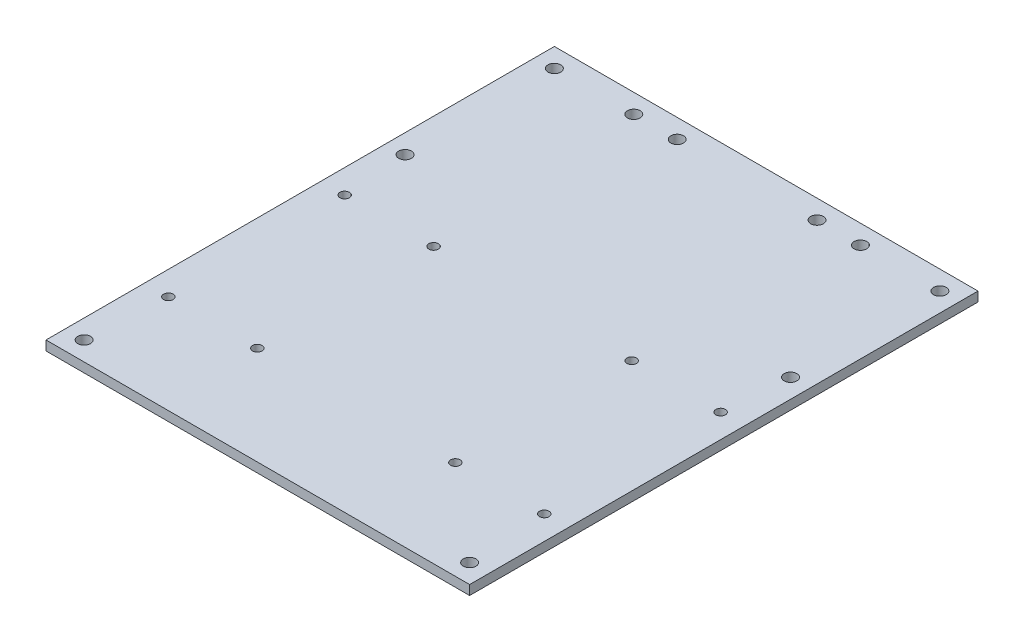
ISO-10303-21;
HEADER;
FILE_DESCRIPTION(('STEP AP214'),'2;1');
FILE_NAME('part.step','',(''),(''),'','','');
FILE_SCHEMA(('AUTOMOTIVE_DESIGN { 1 0 10303 214 1 1 1 1 }'));
ENDSEC;
DATA;
#1=APPLICATION_CONTEXT('core data for automotive mechanical design processes');
#2=APPLICATION_PROTOCOL_DEFINITION('international standard','automotive_design',2000,#1);
#3=PRODUCT_CONTEXT('',#1,'mechanical');
#4=PRODUCT('Part','Part','',(#3));
#5=PRODUCT_RELATED_PRODUCT_CATEGORY('part','',(#4));
#6=PRODUCT_DEFINITION_FORMATION('','',#4);
#7=PRODUCT_DEFINITION_CONTEXT('part definition',#1,'design');
#8=PRODUCT_DEFINITION('design','',#6,#7);
#9=PRODUCT_DEFINITION_SHAPE('','',#8);
#10=(LENGTH_UNIT() NAMED_UNIT(*) SI_UNIT(.MILLI.,.METRE.));
#11=(NAMED_UNIT(*) PLANE_ANGLE_UNIT() SI_UNIT($,.RADIAN.));
#12=(NAMED_UNIT(*) SI_UNIT($,.STERADIAN.) SOLID_ANGLE_UNIT());
#13=UNCERTAINTY_MEASURE_WITH_UNIT(LENGTH_MEASURE(1.E-05),#10,'distance_accuracy_value','');
#14=(GEOMETRIC_REPRESENTATION_CONTEXT(3) GLOBAL_UNCERTAINTY_ASSIGNED_CONTEXT((#13)) GLOBAL_UNIT_ASSIGNED_CONTEXT((#10,
#11,#12)) REPRESENTATION_CONTEXT('',''));
#15=CARTESIAN_POINT('',(0.,0.,0.));
#16=DIRECTION('',(0.,0.,1.));
#17=DIRECTION('',(1.,0.,0.));
#18=AXIS2_PLACEMENT_3D('',#15,#16,#17);
#19=CARTESIAN_POINT('',(66.665,3.,-80.));
#20=DIRECTION('',(-1.,0.,0.));
#21=DIRECTION('',(0.,0.,1.));
#22=AXIS2_PLACEMENT_3D('',#19,#20,#21);
#23=PLANE('',#22);
#24=DIRECTION('',(0.,0.,-1.));
#25=VECTOR('',#24,1.);
#26=CARTESIAN_POINT('',(66.665,0.,-80.));
#27=LINE('',#26,#25);
#28=CARTESIAN_POINT('',(66.665,0.,80.));
#29=VERTEX_POINT('',#28);
#30=CARTESIAN_POINT('',(66.665,0.,-80.));
#31=VERTEX_POINT('',#30);
#32=EDGE_CURVE('E108',#29,#31,#27,.T.);
#33=ORIENTED_EDGE('',*,*,#32,.T.);
#34=DIRECTION('',(0.,-1.,0.));
#35=VECTOR('',#34,1.);
#36=CARTESIAN_POINT('',(66.665,3.,-80.));
#37=LINE('',#36,#35);
#38=CARTESIAN_POINT('',(66.665,3.,-80.));
#39=VERTEX_POINT('',#38);
#40=EDGE_CURVE('E11',#39,#31,#37,.T.);
#41=ORIENTED_EDGE('',*,*,#40,.F.);
#42=DIRECTION('',(0.,0.,-1.));
#43=VECTOR('',#42,1.);
#44=CARTESIAN_POINT('',(66.665,3.,-80.));
#45=LINE('',#44,#43);
#46=CARTESIAN_POINT('',(66.665,3.,80.));
#47=VERTEX_POINT('',#46);
#48=EDGE_CURVE('E95',#47,#39,#45,.T.);
#49=ORIENTED_EDGE('',*,*,#48,.F.);
#50=DIRECTION('',(0.,-1.,0.));
#51=VECTOR('',#50,1.);
#52=CARTESIAN_POINT('',(66.665,3.,80.));
#53=LINE('',#52,#51);
#54=EDGE_CURVE('E104',#47,#29,#53,.T.);
#55=ORIENTED_EDGE('',*,*,#54,.T.);
#56=EDGE_LOOP('',(#33,#41,#49,#55));
#57=FACE_BOUND('',#56,.T.);
#58=ADVANCED_FACE('F42',(#57),#23,.F.);
#59=CARTESIAN_POINT('',(-66.665,3.,-80.));
#60=DIRECTION('',(0.,0.,1.));
#61=DIRECTION('',(1.,0.,0.));
#62=AXIS2_PLACEMENT_3D('',#59,#60,#61);
#63=PLANE('',#62);
#64=DIRECTION('',(-1.,0.,0.));
#65=VECTOR('',#64,1.);
#66=CARTESIAN_POINT('',(-66.665,0.,-80.));
#67=LINE('',#66,#65);
#68=CARTESIAN_POINT('',(-66.665,0.,-80.));
#69=VERTEX_POINT('',#68);
#70=EDGE_CURVE('E99',#31,#69,#67,.T.);
#71=ORIENTED_EDGE('',*,*,#70,.T.);
#72=DIRECTION('',(0.,-1.,0.));
#73=VECTOR('',#72,1.);
#74=CARTESIAN_POINT('',(-66.665,3.,-80.));
#75=LINE('',#74,#73);
#76=CARTESIAN_POINT('',(-66.665,3.,-80.));
#77=VERTEX_POINT('',#76);
#78=EDGE_CURVE('E51',#77,#69,#75,.T.);
#79=ORIENTED_EDGE('',*,*,#78,.F.);
#80=DIRECTION('',(-1.,0.,0.));
#81=VECTOR('',#80,1.);
#82=CARTESIAN_POINT('',(-66.665,3.,-80.));
#83=LINE('',#82,#81);
#84=EDGE_CURVE('E90',#39,#77,#83,.T.);
#85=ORIENTED_EDGE('',*,*,#84,.F.);
#86=ORIENTED_EDGE('',*,*,#40,.T.);
#87=EDGE_LOOP('',(#71,#79,#85,#86));
#88=FACE_BOUND('',#87,.T.);
#89=ADVANCED_FACE('F98',(#88),#63,.F.);
#90=CARTESIAN_POINT('',(-66.665,3.,-80.));
#91=DIRECTION('',(1.,0.,0.));
#92=DIRECTION('',(0.,0.,-1.));
#93=AXIS2_PLACEMENT_3D('',#90,#91,#92);
#94=PLANE('',#93);
#95=DIRECTION('',(0.,0.,1.));
#96=VECTOR('',#95,1.);
#97=CARTESIAN_POINT('',(-66.665,0.,-80.));
#98=LINE('',#97,#96);
#99=CARTESIAN_POINT('',(-66.665,0.,80.));
#100=VERTEX_POINT('',#99);
#101=EDGE_CURVE('E77',#69,#100,#98,.T.);
#102=ORIENTED_EDGE('',*,*,#101,.T.);
#103=DIRECTION('',(0.,-1.,0.));
#104=VECTOR('',#103,1.);
#105=CARTESIAN_POINT('',(-66.665,3.,80.));
#106=LINE('',#105,#104);
#107=CARTESIAN_POINT('',(-66.665,3.,80.));
#108=VERTEX_POINT('',#107);
#109=EDGE_CURVE('E100',#108,#100,#106,.T.);
#110=ORIENTED_EDGE('',*,*,#109,.F.);
#111=DIRECTION('',(0.,0.,1.));
#112=VECTOR('',#111,1.);
#113=CARTESIAN_POINT('',(-66.665,3.,-80.));
#114=LINE('',#113,#112);
#115=EDGE_CURVE('E93',#77,#108,#114,.T.);
#116=ORIENTED_EDGE('',*,*,#115,.F.);
#117=ORIENTED_EDGE('',*,*,#78,.T.);
#118=EDGE_LOOP('',(#102,#110,#116,#117));
#119=FACE_BOUND('',#118,.T.);
#120=ADVANCED_FACE('F102',(#119),#94,.F.);
#121=CARTESIAN_POINT('',(-66.665,3.,80.));
#122=DIRECTION('',(0.,0.,-1.));
#123=DIRECTION('',(-1.,0.,0.));
#124=AXIS2_PLACEMENT_3D('',#121,#122,#123);
#125=PLANE('',#124);
#126=DIRECTION('',(1.,0.,0.));
#127=VECTOR('',#126,1.);
#128=CARTESIAN_POINT('',(-66.665,0.,80.));
#129=LINE('',#128,#127);
#130=EDGE_CURVE('E83',#100,#29,#129,.T.);
#131=ORIENTED_EDGE('',*,*,#130,.T.);
#132=ORIENTED_EDGE('',*,*,#54,.F.);
#133=DIRECTION('',(1.,0.,0.));
#134=VECTOR('',#133,1.);
#135=CARTESIAN_POINT('',(-66.665,3.,80.));
#136=LINE('',#135,#134);
#137=EDGE_CURVE('E60',#108,#47,#136,.T.);
#138=ORIENTED_EDGE('',*,*,#137,.F.);
#139=ORIENTED_EDGE('',*,*,#109,.T.);
#140=EDGE_LOOP('',(#131,#132,#138,#139));
#141=FACE_BOUND('',#140,.T.);
#142=ADVANCED_FACE('F222',(#141),#125,.F.);
#143=CARTESIAN_POINT('',(0.,3.,0.));
#144=DIRECTION('',(0.,1.,0.));
#145=DIRECTION('',(0.,0.,1.));
#146=AXIS2_PLACEMENT_3D('',#143,#144,#145);
#147=PLANE('',#146);
#148=CARTESIAN_POINT('',(-22.,3.,-74.));
#149=DIRECTION('',(0.,1.,0.));
#150=DIRECTION('',(0.,0.,1.));
#151=AXIS2_PLACEMENT_3D('',#148,#149,#150);
#152=CIRCLE('',#151,2.00000000000001);
#153=CARTESIAN_POINT('',(-22.,3.,-72.));
#154=VERTEX_POINT('',#153);
#155=EDGE_CURVE('E505',#154,#154,#152,.T.);
#156=ORIENTED_EDGE('',*,*,#155,.F.);
#157=EDGE_LOOP('',(#156));
#158=FACE_BOUND('',#157,.T.);
#159=CARTESIAN_POINT('',(22.,3.,-74.));
#160=DIRECTION('',(0.,1.,0.));
#161=DIRECTION('',(0.,0.,-1.));
#162=AXIS2_PLACEMENT_3D('',#159,#160,#161);
#163=CIRCLE('',#162,2.00000000000001);
#164=CARTESIAN_POINT('',(22.,3.,-76.));
#165=VERTEX_POINT('',#164);
#166=EDGE_CURVE('E506',#165,#165,#163,.T.);
#167=ORIENTED_EDGE('',*,*,#166,.F.);
#168=EDGE_LOOP('',(#167));
#169=FACE_BOUND('',#168,.T.);
#170=CARTESIAN_POINT('',(-35.665,3.,-74.));
#171=DIRECTION('',(0.,1.,0.));
#172=DIRECTION('',(0.,0.,1.));
#173=AXIS2_PLACEMENT_3D('',#170,#171,#172);
#174=CIRCLE('',#173,2.);
#175=CARTESIAN_POINT('',(-35.665,3.,-72.));
#176=VERTEX_POINT('',#175);
#177=EDGE_CURVE('E118',#176,#176,#174,.T.);
#178=ORIENTED_EDGE('',*,*,#177,.F.);
#179=EDGE_LOOP('',(#178));
#180=FACE_BOUND('',#179,.T.);
#181=CARTESIAN_POINT('',(35.6650000000001,3.,-74.));
#182=DIRECTION('',(0.,1.,0.));
#183=DIRECTION('',(0.,0.,1.));
#184=AXIS2_PLACEMENT_3D('',#181,#182,#183);
#185=CIRCLE('',#184,2.);
#186=CARTESIAN_POINT('',(35.6650000000001,3.,-72.));
#187=VERTEX_POINT('',#186);
#188=EDGE_CURVE('E124',#187,#187,#185,.T.);
#189=ORIENTED_EDGE('',*,*,#188,.F.);
#190=EDGE_LOOP('',(#189));
#191=FACE_BOUND('',#190,.T.);
#192=CARTESIAN_POINT('',(59.165,3.,-6.50000000000002));
#193=DIRECTION('',(0.,1.,0.));
#194=DIRECTION('',(0.,0.,-1.));
#195=AXIS2_PLACEMENT_3D('',#192,#193,#194);
#196=CIRCLE('',#195,1.5);
#197=CARTESIAN_POINT('',(59.165,3.,-8.00000000000002));
#198=VERTEX_POINT('',#197);
#199=EDGE_CURVE('E160',#198,#198,#196,.T.);
#200=ORIENTED_EDGE('',*,*,#199,.F.);
#201=EDGE_LOOP('',(#200));
#202=FACE_BOUND('',#201,.T.);
#203=CARTESIAN_POINT('',(59.165,3.,49.));
#204=DIRECTION('',(0.,1.,0.));
#205=DIRECTION('',(0.,0.,-1.));
#206=AXIS2_PLACEMENT_3D('',#203,#204,#205);
#207=CIRCLE('',#206,1.5);
#208=CARTESIAN_POINT('',(59.165,3.,47.5));
#209=VERTEX_POINT('',#208);
#210=EDGE_CURVE('E154',#209,#209,#207,.T.);
#211=ORIENTED_EDGE('',*,*,#210,.F.);
#212=EDGE_LOOP('',(#211));
#213=FACE_BOUND('',#212,.T.);
#214=CARTESIAN_POINT('',(31.165,3.,49.));
#215=DIRECTION('',(0.,1.,0.));
#216=DIRECTION('',(0.,0.,-1.));
#217=AXIS2_PLACEMENT_3D('',#214,#215,#216);
#218=CIRCLE('',#217,1.5);
#219=CARTESIAN_POINT('',(31.165,3.,47.5));
#220=VERTEX_POINT('',#219);
#221=EDGE_CURVE('E148',#220,#220,#218,.T.);
#222=ORIENTED_EDGE('',*,*,#221,.F.);
#223=EDGE_LOOP('',(#222));
#224=FACE_BOUND('',#223,.T.);
#225=CARTESIAN_POINT('',(-31.165,3.,49.));
#226=DIRECTION('',(0.,1.,0.));
#227=DIRECTION('',(0.,0.,1.));
#228=AXIS2_PLACEMENT_3D('',#225,#226,#227);
#229=CIRCLE('',#228,1.5);
#230=CARTESIAN_POINT('',(-31.165,3.,50.5));
#231=VERTEX_POINT('',#230);
#232=EDGE_CURVE('E141',#231,#231,#229,.T.);
#233=ORIENTED_EDGE('',*,*,#232,.F.);
#234=EDGE_LOOP('',(#233));
#235=FACE_BOUND('',#234,.T.);
#236=CARTESIAN_POINT('',(60.665,3.,-27.));
#237=DIRECTION('',(0.,1.,0.));
#238=DIRECTION('',(0.,0.,-1.));
#239=AXIS2_PLACEMENT_3D('',#236,#237,#238);
#240=CIRCLE('',#239,2.);
#241=CARTESIAN_POINT('',(60.665,3.,-29.));
#242=VERTEX_POINT('',#241);
#243=EDGE_CURVE('E177',#242,#242,#240,.T.);
#244=ORIENTED_EDGE('',*,*,#243,.F.);
#245=EDGE_LOOP('',(#244));
#246=FACE_BOUND('',#245,.T.);
#247=CARTESIAN_POINT('',(-59.165,3.,-6.50000000000002));
#248=DIRECTION('',(0.,1.,0.));
#249=DIRECTION('',(0.,0.,1.));
#250=AXIS2_PLACEMENT_3D('',#247,#248,#249);
#251=CIRCLE('',#250,1.5);
#252=CARTESIAN_POINT('',(-59.165,3.,-5.00000000000002));
#253=VERTEX_POINT('',#252);
#254=EDGE_CURVE('E184',#253,#253,#251,.T.);
#255=ORIENTED_EDGE('',*,*,#254,.F.);
#256=EDGE_LOOP('',(#255));
#257=FACE_BOUND('',#256,.T.);
#258=CARTESIAN_POINT('',(-31.165,3.,-6.50000000000002));
#259=DIRECTION('',(0.,1.,0.));
#260=DIRECTION('',(0.,0.,1.));
#261=AXIS2_PLACEMENT_3D('',#258,#259,#260);
#262=CIRCLE('',#261,1.5);
#263=CARTESIAN_POINT('',(-31.165,3.,-5.00000000000002));
#264=VERTEX_POINT('',#263);
#265=EDGE_CURVE('E165',#264,#264,#262,.T.);
#266=ORIENTED_EDGE('',*,*,#265,.F.);
#267=EDGE_LOOP('',(#266));
#268=FACE_BOUND('',#267,.T.);
#269=CARTESIAN_POINT('',(-59.165,3.,49.));
#270=DIRECTION('',(0.,1.,0.));
#271=DIRECTION('',(0.,0.,1.));
#272=AXIS2_PLACEMENT_3D('',#269,#270,#271);
#273=CIRCLE('',#272,1.5);
#274=CARTESIAN_POINT('',(-59.165,3.,50.5));
#275=VERTEX_POINT('',#274);
#276=EDGE_CURVE('E172',#275,#275,#273,.T.);
#277=ORIENTED_EDGE('',*,*,#276,.F.);
#278=EDGE_LOOP('',(#277));
#279=FACE_BOUND('',#278,.T.);
#280=CARTESIAN_POINT('',(31.165,3.,-6.50000000000002));
#281=DIRECTION('',(0.,1.,0.));
#282=DIRECTION('',(0.,0.,-1.));
#283=AXIS2_PLACEMENT_3D('',#280,#281,#282);
#284=CIRCLE('',#283,1.5);
#285=CARTESIAN_POINT('',(31.165,3.,-8.00000000000002));
#286=VERTEX_POINT('',#285);
#287=EDGE_CURVE('E135',#286,#286,#284,.T.);
#288=ORIENTED_EDGE('',*,*,#287,.F.);
#289=EDGE_LOOP('',(#288));
#290=FACE_BOUND('',#289,.T.);
#291=CARTESIAN_POINT('',(-60.665,3.,-27.));
#292=DIRECTION('',(0.,1.,0.));
#293=DIRECTION('',(0.,0.,1.));
#294=AXIS2_PLACEMENT_3D('',#291,#292,#293);
#295=CIRCLE('',#294,2.);
#296=CARTESIAN_POINT('',(-60.665,3.,-25.));
#297=VERTEX_POINT('',#296);
#298=EDGE_CURVE('E180',#297,#297,#295,.T.);
#299=ORIENTED_EDGE('',*,*,#298,.F.);
#300=EDGE_LOOP('',(#299));
#301=FACE_BOUND('',#300,.T.);
#302=CARTESIAN_POINT('',(-60.665,3.,74.));
#303=DIRECTION('',(0.,1.,0.));
#304=DIRECTION('',(0.,0.,-1.));
#305=AXIS2_PLACEMENT_3D('',#302,#303,#304);
#306=CIRCLE('',#305,2.);
#307=CARTESIAN_POINT('',(-60.665,3.,72.));
#308=VERTEX_POINT('',#307);
#309=EDGE_CURVE('E208',#308,#308,#306,.T.);
#310=ORIENTED_EDGE('',*,*,#309,.F.);
#311=EDGE_LOOP('',(#310));
#312=FACE_BOUND('',#311,.T.);
#313=CARTESIAN_POINT('',(60.6650000000001,3.,73.9999999999999));
#314=DIRECTION('',(0.,1.,0.));
#315=DIRECTION('',(0.,0.,1.));
#316=AXIS2_PLACEMENT_3D('',#313,#314,#315);
#317=CIRCLE('',#316,2.);
#318=CARTESIAN_POINT('',(60.6650000000001,3.,75.9999999999999));
#319=VERTEX_POINT('',#318);
#320=EDGE_CURVE('E202',#319,#319,#317,.T.);
#321=ORIENTED_EDGE('',*,*,#320,.F.);
#322=EDGE_LOOP('',(#321));
#323=FACE_BOUND('',#322,.T.);
#324=CARTESIAN_POINT('',(60.6650000000001,3.,-73.9999999999999));
#325=DIRECTION('',(0.,1.,0.));
#326=DIRECTION('',(0.,0.,-1.));
#327=AXIS2_PLACEMENT_3D('',#324,#325,#326);
#328=CIRCLE('',#327,2.);
#329=CARTESIAN_POINT('',(60.6650000000001,3.,-75.9999999999999));
#330=VERTEX_POINT('',#329);
#331=EDGE_CURVE('E195',#330,#330,#328,.T.);
#332=ORIENTED_EDGE('',*,*,#331,.F.);
#333=EDGE_LOOP('',(#332));
#334=FACE_BOUND('',#333,.T.);
#335=CARTESIAN_POINT('',(-60.665,3.,-74.));
#336=DIRECTION('',(0.,1.,0.));
#337=DIRECTION('',(0.,0.,1.));
#338=AXIS2_PLACEMENT_3D('',#335,#336,#337);
#339=CIRCLE('',#338,2.);
#340=CARTESIAN_POINT('',(-60.665,3.,-72.));
#341=VERTEX_POINT('',#340);
#342=EDGE_CURVE('E198',#341,#341,#339,.T.);
#343=ORIENTED_EDGE('',*,*,#342,.F.);
#344=EDGE_LOOP('',(#343));
#345=FACE_BOUND('',#344,.T.);
#346=ORIENTED_EDGE('',*,*,#48,.T.);
#347=ORIENTED_EDGE('',*,*,#84,.T.);
#348=ORIENTED_EDGE('',*,*,#115,.T.);
#349=ORIENTED_EDGE('',*,*,#137,.T.);
#350=EDGE_LOOP('',(#346,#347,#348,#349));
#351=FACE_BOUND('',#350,.T.);
#352=ADVANCED_FACE('F91',(#158,#169,#180,#191,#202,#213,#224,#235,#246,#257,#268,#279,#290,#301,
#312,#323,#334,#345,#351),#147,.T.);
#353=CARTESIAN_POINT('',(0.,0.,0.));
#354=DIRECTION('',(0.,1.,0.));
#355=DIRECTION('',(0.,0.,1.));
#356=AXIS2_PLACEMENT_3D('',#353,#354,#355);
#357=PLANE('',#356);
#358=CARTESIAN_POINT('',(-22.,0.,-74.));
#359=DIRECTION('',(0.,1.,0.));
#360=DIRECTION('',(0.,0.,1.));
#361=AXIS2_PLACEMENT_3D('',#358,#359,#360);
#362=CIRCLE('',#361,2.00000000000001);
#363=CARTESIAN_POINT('',(-22.,0.,-72.));
#364=VERTEX_POINT('',#363);
#365=EDGE_CURVE('E129',#364,#364,#362,.T.);
#366=ORIENTED_EDGE('',*,*,#365,.T.);
#367=EDGE_LOOP('',(#366));
#368=FACE_BOUND('',#367,.T.);
#369=CARTESIAN_POINT('',(22.,0.,-74.));
#370=DIRECTION('',(0.,1.,0.));
#371=DIRECTION('',(0.,0.,-1.));
#372=AXIS2_PLACEMENT_3D('',#369,#370,#371);
#373=CIRCLE('',#372,2.00000000000001);
#374=CARTESIAN_POINT('',(22.,0.,-76.));
#375=VERTEX_POINT('',#374);
#376=EDGE_CURVE('E132',#375,#375,#373,.T.);
#377=ORIENTED_EDGE('',*,*,#376,.T.);
#378=EDGE_LOOP('',(#377));
#379=FACE_BOUND('',#378,.T.);
#380=CARTESIAN_POINT('',(-35.665,0.,-74.));
#381=DIRECTION('',(0.,1.,0.));
#382=DIRECTION('',(0.,0.,1.));
#383=AXIS2_PLACEMENT_3D('',#380,#381,#382);
#384=CIRCLE('',#383,2.);
#385=CARTESIAN_POINT('',(-35.665,0.,-72.));
#386=VERTEX_POINT('',#385);
#387=EDGE_CURVE('E45',#386,#386,#384,.T.);
#388=ORIENTED_EDGE('',*,*,#387,.T.);
#389=EDGE_LOOP('',(#388));
#390=FACE_BOUND('',#389,.T.);
#391=CARTESIAN_POINT('',(35.6650000000001,0.,-74.));
#392=DIRECTION('',(0.,1.,0.));
#393=DIRECTION('',(0.,0.,1.));
#394=AXIS2_PLACEMENT_3D('',#391,#392,#393);
#395=CIRCLE('',#394,2.);
#396=CARTESIAN_POINT('',(35.6650000000001,0.,-72.));
#397=VERTEX_POINT('',#396);
#398=EDGE_CURVE('E116',#397,#397,#395,.T.);
#399=ORIENTED_EDGE('',*,*,#398,.T.);
#400=EDGE_LOOP('',(#399));
#401=FACE_BOUND('',#400,.T.);
#402=CARTESIAN_POINT('',(59.165,0.,-6.50000000000002));
#403=DIRECTION('',(0.,1.,0.));
#404=DIRECTION('',(0.,0.,-1.));
#405=AXIS2_PLACEMENT_3D('',#402,#403,#404);
#406=CIRCLE('',#405,1.5);
#407=CARTESIAN_POINT('',(59.165,0.,-8.00000000000002));
#408=VERTEX_POINT('',#407);
#409=EDGE_CURVE('E138',#408,#408,#406,.T.);
#410=ORIENTED_EDGE('',*,*,#409,.T.);
#411=EDGE_LOOP('',(#410));
#412=FACE_BOUND('',#411,.T.);
#413=CARTESIAN_POINT('',(59.165,0.,49.));
#414=DIRECTION('',(0.,1.,0.));
#415=DIRECTION('',(0.,0.,-1.));
#416=AXIS2_PLACEMENT_3D('',#413,#414,#415);
#417=CIRCLE('',#416,1.5);
#418=CARTESIAN_POINT('',(59.165,0.,47.5));
#419=VERTEX_POINT('',#418);
#420=EDGE_CURVE('E157',#419,#419,#417,.T.);
#421=ORIENTED_EDGE('',*,*,#420,.T.);
#422=EDGE_LOOP('',(#421));
#423=FACE_BOUND('',#422,.T.);
#424=CARTESIAN_POINT('',(31.165,0.,49.));
#425=DIRECTION('',(0.,1.,0.));
#426=DIRECTION('',(0.,0.,-1.));
#427=AXIS2_PLACEMENT_3D('',#424,#425,#426);
#428=CIRCLE('',#427,1.5);
#429=CARTESIAN_POINT('',(31.165,0.,47.5));
#430=VERTEX_POINT('',#429);
#431=EDGE_CURVE('E151',#430,#430,#428,.T.);
#432=ORIENTED_EDGE('',*,*,#431,.T.);
#433=EDGE_LOOP('',(#432));
#434=FACE_BOUND('',#433,.T.);
#435=CARTESIAN_POINT('',(-31.165,0.,49.));
#436=DIRECTION('',(0.,1.,0.));
#437=DIRECTION('',(0.,0.,1.));
#438=AXIS2_PLACEMENT_3D('',#435,#436,#437);
#439=CIRCLE('',#438,1.5);
#440=CARTESIAN_POINT('',(-31.165,0.,50.5));
#441=VERTEX_POINT('',#440);
#442=EDGE_CURVE('E145',#441,#441,#439,.T.);
#443=ORIENTED_EDGE('',*,*,#442,.T.);
#444=EDGE_LOOP('',(#443));
#445=FACE_BOUND('',#444,.T.);
#446=CARTESIAN_POINT('',(60.665,0.,-27.));
#447=DIRECTION('',(0.,1.,0.));
#448=DIRECTION('',(0.,0.,-1.));
#449=AXIS2_PLACEMENT_3D('',#446,#447,#448);
#450=CIRCLE('',#449,2.);
#451=CARTESIAN_POINT('',(60.665,0.,-29.));
#452=VERTEX_POINT('',#451);
#453=EDGE_CURVE('E181',#452,#452,#450,.T.);
#454=ORIENTED_EDGE('',*,*,#453,.T.);
#455=EDGE_LOOP('',(#454));
#456=FACE_BOUND('',#455,.T.);
#457=CARTESIAN_POINT('',(-59.165,0.,-6.50000000000002));
#458=DIRECTION('',(0.,1.,0.));
#459=DIRECTION('',(0.,0.,1.));
#460=AXIS2_PLACEMENT_3D('',#457,#458,#459);
#461=CIRCLE('',#460,1.5);
#462=CARTESIAN_POINT('',(-59.165,0.,-5.00000000000002));
#463=VERTEX_POINT('',#462);
#464=EDGE_CURVE('E168',#463,#463,#461,.T.);
#465=ORIENTED_EDGE('',*,*,#464,.T.);
#466=EDGE_LOOP('',(#465));
#467=FACE_BOUND('',#466,.T.);
#468=CARTESIAN_POINT('',(-31.165,0.,-6.50000000000002));
#469=DIRECTION('',(0.,1.,0.));
#470=DIRECTION('',(0.,0.,1.));
#471=AXIS2_PLACEMENT_3D('',#468,#469,#470);
#472=CIRCLE('',#471,1.5);
#473=CARTESIAN_POINT('',(-31.165,0.,-5.00000000000002));
#474=VERTEX_POINT('',#473);
#475=EDGE_CURVE('E169',#474,#474,#472,.T.);
#476=ORIENTED_EDGE('',*,*,#475,.T.);
#477=EDGE_LOOP('',(#476));
#478=FACE_BOUND('',#477,.T.);
#479=CARTESIAN_POINT('',(-59.165,0.,49.));
#480=DIRECTION('',(0.,1.,0.));
#481=DIRECTION('',(0.,0.,1.));
#482=AXIS2_PLACEMENT_3D('',#479,#480,#481);
#483=CIRCLE('',#482,1.5);
#484=CARTESIAN_POINT('',(-59.165,0.,50.5));
#485=VERTEX_POINT('',#484);
#486=EDGE_CURVE('E144',#485,#485,#483,.T.);
#487=ORIENTED_EDGE('',*,*,#486,.T.);
#488=EDGE_LOOP('',(#487));
#489=FACE_BOUND('',#488,.T.);
#490=CARTESIAN_POINT('',(31.165,0.,-6.50000000000002));
#491=DIRECTION('',(0.,1.,0.));
#492=DIRECTION('',(0.,0.,-1.));
#493=AXIS2_PLACEMENT_3D('',#490,#491,#492);
#494=CIRCLE('',#493,1.5);
#495=CARTESIAN_POINT('',(31.165,0.,-8.00000000000002));
#496=VERTEX_POINT('',#495);
#497=EDGE_CURVE('E122',#496,#496,#494,.T.);
#498=ORIENTED_EDGE('',*,*,#497,.T.);
#499=EDGE_LOOP('',(#498));
#500=FACE_BOUND('',#499,.T.);
#501=CARTESIAN_POINT('',(-60.665,0.,-27.));
#502=DIRECTION('',(0.,1.,0.));
#503=DIRECTION('',(0.,0.,1.));
#504=AXIS2_PLACEMENT_3D('',#501,#502,#503);
#505=CIRCLE('',#504,2.);
#506=CARTESIAN_POINT('',(-60.665,0.,-25.));
#507=VERTEX_POINT('',#506);
#508=EDGE_CURVE('E189',#507,#507,#505,.T.);
#509=ORIENTED_EDGE('',*,*,#508,.T.);
#510=EDGE_LOOP('',(#509));
#511=FACE_BOUND('',#510,.T.);
#512=CARTESIAN_POINT('',(-60.665,0.,74.));
#513=DIRECTION('',(0.,1.,0.));
#514=DIRECTION('',(0.,0.,-1.));
#515=AXIS2_PLACEMENT_3D('',#512,#513,#514);
#516=CIRCLE('',#515,2.);
#517=CARTESIAN_POINT('',(-60.665,0.,72.));
#518=VERTEX_POINT('',#517);
#519=EDGE_CURVE('E192',#518,#518,#516,.T.);
#520=ORIENTED_EDGE('',*,*,#519,.T.);
#521=EDGE_LOOP('',(#520));
#522=FACE_BOUND('',#521,.T.);
#523=CARTESIAN_POINT('',(60.6650000000001,0.,73.9999999999999));
#524=DIRECTION('',(0.,1.,0.));
#525=DIRECTION('',(0.,0.,1.));
#526=AXIS2_PLACEMENT_3D('',#523,#524,#525);
#527=CIRCLE('',#526,2.);
#528=CARTESIAN_POINT('',(60.6650000000001,0.,75.9999999999999));
#529=VERTEX_POINT('',#528);
#530=EDGE_CURVE('E205',#529,#529,#527,.T.);
#531=ORIENTED_EDGE('',*,*,#530,.T.);
#532=EDGE_LOOP('',(#531));
#533=FACE_BOUND('',#532,.T.);
#534=CARTESIAN_POINT('',(60.6650000000001,0.,-73.9999999999999));
#535=DIRECTION('',(0.,1.,0.));
#536=DIRECTION('',(0.,0.,-1.));
#537=AXIS2_PLACEMENT_3D('',#534,#535,#536);
#538=CIRCLE('',#537,2.);
#539=CARTESIAN_POINT('',(60.6650000000001,0.,-75.9999999999999));
#540=VERTEX_POINT('',#539);
#541=EDGE_CURVE('E199',#540,#540,#538,.T.);
#542=ORIENTED_EDGE('',*,*,#541,.T.);
#543=EDGE_LOOP('',(#542));
#544=FACE_BOUND('',#543,.T.);
#545=CARTESIAN_POINT('',(-60.665,0.,-74.));
#546=DIRECTION('',(0.,1.,0.));
#547=DIRECTION('',(0.,0.,1.));
#548=AXIS2_PLACEMENT_3D('',#545,#546,#547);
#549=CIRCLE('',#548,2.);
#550=CARTESIAN_POINT('',(-60.665,0.,-72.));
#551=VERTEX_POINT('',#550);
#552=EDGE_CURVE('E111',#551,#551,#549,.T.);
#553=ORIENTED_EDGE('',*,*,#552,.T.);
#554=EDGE_LOOP('',(#553));
#555=FACE_BOUND('',#554,.T.);
#556=ORIENTED_EDGE('',*,*,#32,.F.);
#557=ORIENTED_EDGE('',*,*,#130,.F.);
#558=ORIENTED_EDGE('',*,*,#101,.F.);
#559=ORIENTED_EDGE('',*,*,#70,.F.);
#560=EDGE_LOOP('',(#556,#557,#558,#559));
#561=FACE_BOUND('',#560,.T.);
#562=ADVANCED_FACE('F221',(#368,#379,#390,#401,#412,#423,#434,#445,#456,#467,#478,#489,#500,
#511,#522,#533,#544,#555,#561),#357,.F.);
#563=CARTESIAN_POINT('',(-60.665,0.,-74.));
#564=DIRECTION('',(0.,1.,0.));
#565=DIRECTION('',(0.,0.,1.));
#566=AXIS2_PLACEMENT_3D('',#563,#564,#565);
#567=CYLINDRICAL_SURFACE('',#566,2.);
#568=ORIENTED_EDGE('',*,*,#552,.F.);
#569=EDGE_LOOP('',(#568));
#570=FACE_BOUND('',#569,.T.);
#571=ORIENTED_EDGE('',*,*,#342,.T.);
#572=EDGE_LOOP('',(#571));
#573=FACE_BOUND('',#572,.T.);
#574=ADVANCED_FACE('F218',(#570,#573),#567,.F.);
#575=CARTESIAN_POINT('',(60.6650000000001,0.,-73.9999999999999));
#576=DIRECTION('',(0.,1.,0.));
#577=DIRECTION('',(0.,0.,1.));
#578=AXIS2_PLACEMENT_3D('',#575,#576,#577);
#579=CYLINDRICAL_SURFACE('',#578,2.);
#580=ORIENTED_EDGE('',*,*,#541,.F.);
#581=EDGE_LOOP('',(#580));
#582=FACE_BOUND('',#581,.T.);
#583=ORIENTED_EDGE('',*,*,#331,.T.);
#584=EDGE_LOOP('',(#583));
#585=FACE_BOUND('',#584,.T.);
#586=ADVANCED_FACE('F273',(#582,#585),#579,.F.);
#587=CARTESIAN_POINT('',(60.6650000000001,0.,73.9999999999999));
#588=DIRECTION('',(0.,1.,0.));
#589=DIRECTION('',(0.,0.,1.));
#590=AXIS2_PLACEMENT_3D('',#587,#588,#589);
#591=CYLINDRICAL_SURFACE('',#590,2.);
#592=ORIENTED_EDGE('',*,*,#530,.F.);
#593=EDGE_LOOP('',(#592));
#594=FACE_BOUND('',#593,.T.);
#595=ORIENTED_EDGE('',*,*,#320,.T.);
#596=EDGE_LOOP('',(#595));
#597=FACE_BOUND('',#596,.T.);
#598=ADVANCED_FACE('F279',(#594,#597),#591,.F.);
#599=CARTESIAN_POINT('',(-60.665,0.,74.));
#600=DIRECTION('',(0.,1.,0.));
#601=DIRECTION('',(0.,0.,1.));
#602=AXIS2_PLACEMENT_3D('',#599,#600,#601);
#603=CYLINDRICAL_SURFACE('',#602,2.);
#604=ORIENTED_EDGE('',*,*,#519,.F.);
#605=EDGE_LOOP('',(#604));
#606=FACE_BOUND('',#605,.T.);
#607=ORIENTED_EDGE('',*,*,#309,.T.);
#608=EDGE_LOOP('',(#607));
#609=FACE_BOUND('',#608,.T.);
#610=ADVANCED_FACE('F287',(#606,#609),#603,.F.);
#611=CARTESIAN_POINT('',(-60.665,0.,-27.));
#612=DIRECTION('',(0.,1.,0.));
#613=DIRECTION('',(0.,0.,1.));
#614=AXIS2_PLACEMENT_3D('',#611,#612,#613);
#615=CYLINDRICAL_SURFACE('',#614,2.);
#616=ORIENTED_EDGE('',*,*,#508,.F.);
#617=EDGE_LOOP('',(#616));
#618=FACE_BOUND('',#617,.T.);
#619=ORIENTED_EDGE('',*,*,#298,.T.);
#620=EDGE_LOOP('',(#619));
#621=FACE_BOUND('',#620,.T.);
#622=ADVANCED_FACE('F295',(#618,#621),#615,.F.);
#623=CARTESIAN_POINT('',(31.165,0.,-6.50000000000002));
#624=DIRECTION('',(0.,1.,0.));
#625=DIRECTION('',(0.,0.,1.));
#626=AXIS2_PLACEMENT_3D('',#623,#624,#625);
#627=CYLINDRICAL_SURFACE('',#626,1.5);
#628=ORIENTED_EDGE('',*,*,#497,.F.);
#629=EDGE_LOOP('',(#628));
#630=FACE_BOUND('',#629,.T.);
#631=ORIENTED_EDGE('',*,*,#287,.T.);
#632=EDGE_LOOP('',(#631));
#633=FACE_BOUND('',#632,.T.);
#634=ADVANCED_FACE('F303',(#630,#633),#627,.F.);
#635=CARTESIAN_POINT('',(-59.165,0.,49.));
#636=DIRECTION('',(0.,1.,0.));
#637=DIRECTION('',(0.,0.,1.));
#638=AXIS2_PLACEMENT_3D('',#635,#636,#637);
#639=CYLINDRICAL_SURFACE('',#638,1.5);
#640=ORIENTED_EDGE('',*,*,#486,.F.);
#641=EDGE_LOOP('',(#640));
#642=FACE_BOUND('',#641,.T.);
#643=ORIENTED_EDGE('',*,*,#276,.T.);
#644=EDGE_LOOP('',(#643));
#645=FACE_BOUND('',#644,.T.);
#646=ADVANCED_FACE('F311',(#642,#645),#639,.F.);
#647=CARTESIAN_POINT('',(-31.165,0.,-6.50000000000002));
#648=DIRECTION('',(0.,1.,0.));
#649=DIRECTION('',(0.,0.,1.));
#650=AXIS2_PLACEMENT_3D('',#647,#648,#649);
#651=CYLINDRICAL_SURFACE('',#650,1.5);
#652=ORIENTED_EDGE('',*,*,#475,.F.);
#653=EDGE_LOOP('',(#652));
#654=FACE_BOUND('',#653,.T.);
#655=ORIENTED_EDGE('',*,*,#265,.T.);
#656=EDGE_LOOP('',(#655));
#657=FACE_BOUND('',#656,.T.);
#658=ADVANCED_FACE('F319',(#654,#657),#651,.F.);
#659=CARTESIAN_POINT('',(-59.165,0.,-6.50000000000002));
#660=DIRECTION('',(0.,1.,0.));
#661=DIRECTION('',(0.,0.,1.));
#662=AXIS2_PLACEMENT_3D('',#659,#660,#661);
#663=CYLINDRICAL_SURFACE('',#662,1.5);
#664=ORIENTED_EDGE('',*,*,#464,.F.);
#665=EDGE_LOOP('',(#664));
#666=FACE_BOUND('',#665,.T.);
#667=ORIENTED_EDGE('',*,*,#254,.T.);
#668=EDGE_LOOP('',(#667));
#669=FACE_BOUND('',#668,.T.);
#670=ADVANCED_FACE('F327',(#666,#669),#663,.F.);
#671=CARTESIAN_POINT('',(60.665,0.,-27.));
#672=DIRECTION('',(0.,1.,0.));
#673=DIRECTION('',(0.,0.,1.));
#674=AXIS2_PLACEMENT_3D('',#671,#672,#673);
#675=CYLINDRICAL_SURFACE('',#674,2.);
#676=ORIENTED_EDGE('',*,*,#453,.F.);
#677=EDGE_LOOP('',(#676));
#678=FACE_BOUND('',#677,.T.);
#679=ORIENTED_EDGE('',*,*,#243,.T.);
#680=EDGE_LOOP('',(#679));
#681=FACE_BOUND('',#680,.T.);
#682=ADVANCED_FACE('F335',(#678,#681),#675,.F.);
#683=CARTESIAN_POINT('',(-31.165,0.,49.));
#684=DIRECTION('',(0.,1.,0.));
#685=DIRECTION('',(0.,0.,1.));
#686=AXIS2_PLACEMENT_3D('',#683,#684,#685);
#687=CYLINDRICAL_SURFACE('',#686,1.5);
#688=ORIENTED_EDGE('',*,*,#442,.F.);
#689=EDGE_LOOP('',(#688));
#690=FACE_BOUND('',#689,.T.);
#691=ORIENTED_EDGE('',*,*,#232,.T.);
#692=EDGE_LOOP('',(#691));
#693=FACE_BOUND('',#692,.T.);
#694=ADVANCED_FACE('F343',(#690,#693),#687,.F.);
#695=CARTESIAN_POINT('',(31.165,0.,49.));
#696=DIRECTION('',(0.,1.,0.));
#697=DIRECTION('',(0.,0.,1.));
#698=AXIS2_PLACEMENT_3D('',#695,#696,#697);
#699=CYLINDRICAL_SURFACE('',#698,1.5);
#700=ORIENTED_EDGE('',*,*,#431,.F.);
#701=EDGE_LOOP('',(#700));
#702=FACE_BOUND('',#701,.T.);
#703=ORIENTED_EDGE('',*,*,#221,.T.);
#704=EDGE_LOOP('',(#703));
#705=FACE_BOUND('',#704,.T.);
#706=ADVANCED_FACE('F351',(#702,#705),#699,.F.);
#707=CARTESIAN_POINT('',(59.165,0.,49.));
#708=DIRECTION('',(0.,1.,0.));
#709=DIRECTION('',(0.,0.,1.));
#710=AXIS2_PLACEMENT_3D('',#707,#708,#709);
#711=CYLINDRICAL_SURFACE('',#710,1.5);
#712=ORIENTED_EDGE('',*,*,#420,.F.);
#713=EDGE_LOOP('',(#712));
#714=FACE_BOUND('',#713,.T.);
#715=ORIENTED_EDGE('',*,*,#210,.T.);
#716=EDGE_LOOP('',(#715));
#717=FACE_BOUND('',#716,.T.);
#718=ADVANCED_FACE('F359',(#714,#717),#711,.F.);
#719=CARTESIAN_POINT('',(59.165,0.,-6.50000000000002));
#720=DIRECTION('',(0.,1.,0.));
#721=DIRECTION('',(0.,0.,1.));
#722=AXIS2_PLACEMENT_3D('',#719,#720,#721);
#723=CYLINDRICAL_SURFACE('',#722,1.5);
#724=ORIENTED_EDGE('',*,*,#409,.F.);
#725=EDGE_LOOP('',(#724));
#726=FACE_BOUND('',#725,.T.);
#727=ORIENTED_EDGE('',*,*,#199,.T.);
#728=EDGE_LOOP('',(#727));
#729=FACE_BOUND('',#728,.T.);
#730=ADVANCED_FACE('F367',(#726,#729),#723,.F.);
#731=CARTESIAN_POINT('',(35.6650000000001,-0.175,-74.));
#732=DIRECTION('',(0.,1.,0.));
#733=DIRECTION('',(0.,0.,1.));
#734=AXIS2_PLACEMENT_3D('',#731,#732,#733);
#735=CYLINDRICAL_SURFACE('',#734,2.);
#736=ORIENTED_EDGE('',*,*,#188,.T.);
#737=EDGE_LOOP('',(#736));
#738=FACE_BOUND('',#737,.T.);
#739=ORIENTED_EDGE('',*,*,#398,.F.);
#740=EDGE_LOOP('',(#739));
#741=FACE_BOUND('',#740,.T.);
#742=ADVANCED_FACE('F375',(#738,#741),#735,.F.);
#743=CARTESIAN_POINT('',(-35.665,-0.175,-74.));
#744=DIRECTION('',(0.,1.,0.));
#745=DIRECTION('',(0.,0.,1.));
#746=AXIS2_PLACEMENT_3D('',#743,#744,#745);
#747=CYLINDRICAL_SURFACE('',#746,2.);
#748=ORIENTED_EDGE('',*,*,#177,.T.);
#749=EDGE_LOOP('',(#748));
#750=FACE_BOUND('',#749,.T.);
#751=ORIENTED_EDGE('',*,*,#387,.F.);
#752=EDGE_LOOP('',(#751));
#753=FACE_BOUND('',#752,.T.);
#754=ADVANCED_FACE('F383',(#750,#753),#747,.F.);
#755=CARTESIAN_POINT('',(22.,0.,-74.));
#756=DIRECTION('',(0.,1.,0.));
#757=DIRECTION('',(0.,0.,1.));
#758=AXIS2_PLACEMENT_3D('',#755,#756,#757);
#759=CYLINDRICAL_SURFACE('',#758,2.00000000000001);
#760=ORIENTED_EDGE('',*,*,#376,.F.);
#761=EDGE_LOOP('',(#760));
#762=FACE_BOUND('',#761,.T.);
#763=ORIENTED_EDGE('',*,*,#166,.T.);
#764=EDGE_LOOP('',(#763));
#765=FACE_BOUND('',#764,.T.);
#766=ADVANCED_FACE('F390',(#762,#765),#759,.F.);
#767=CARTESIAN_POINT('',(-22.,0.,-74.));
#768=DIRECTION('',(0.,1.,0.));
#769=DIRECTION('',(0.,0.,1.));
#770=AXIS2_PLACEMENT_3D('',#767,#768,#769);
#771=CYLINDRICAL_SURFACE('',#770,2.00000000000001);
#772=ORIENTED_EDGE('',*,*,#365,.F.);
#773=EDGE_LOOP('',(#772));
#774=FACE_BOUND('',#773,.T.);
#775=ORIENTED_EDGE('',*,*,#155,.T.);
#776=EDGE_LOOP('',(#775));
#777=FACE_BOUND('',#776,.T.);
#778=ADVANCED_FACE('F396',(#774,#777),#771,.F.);
#779=CLOSED_SHELL('',(#58,#89,#120,#142,#352,#562,#574,#586,#598,#610,#622,#634,#646,#658,#670,
#682,#694,#706,#718,#730,#742,#754,#766,#778));
#780=MANIFOLD_SOLID_BREP('B2',#779);
#781=ADVANCED_BREP_SHAPE_REPRESENTATION('',(#18,#780),#14);
#782=SHAPE_DEFINITION_REPRESENTATION(#9,#781);
ENDSEC;
END-ISO-10303-21;
